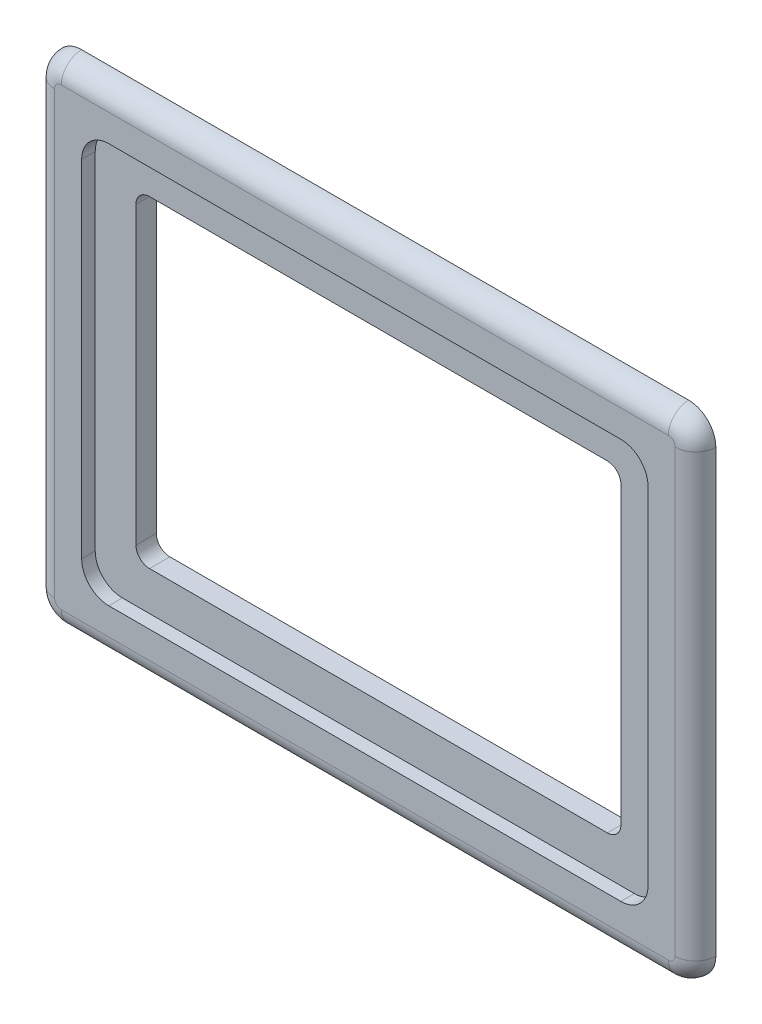
ISO-10303-21;
HEADER;
FILE_DESCRIPTION(('STEP AP214'),'2;1');
FILE_NAME('part.step','',(''),(''),'','','');
FILE_SCHEMA(('AUTOMOTIVE_DESIGN { 1 0 10303 214 1 1 1 1 }'));
ENDSEC;
DATA;
#1=APPLICATION_CONTEXT('core data for automotive mechanical design processes');
#2=APPLICATION_PROTOCOL_DEFINITION('international standard','automotive_design',2000,#1);
#3=PRODUCT_CONTEXT('',#1,'mechanical');
#4=PRODUCT('Part','Part','',(#3));
#5=PRODUCT_RELATED_PRODUCT_CATEGORY('part','',(#4));
#6=PRODUCT_DEFINITION_FORMATION('','',#4);
#7=PRODUCT_DEFINITION_CONTEXT('part definition',#1,'design');
#8=PRODUCT_DEFINITION('design','',#6,#7);
#9=PRODUCT_DEFINITION_SHAPE('','',#8);
#10=(LENGTH_UNIT() NAMED_UNIT(*) SI_UNIT(.MILLI.,.METRE.));
#11=(NAMED_UNIT(*) PLANE_ANGLE_UNIT() SI_UNIT($,.RADIAN.));
#12=(NAMED_UNIT(*) SI_UNIT($,.STERADIAN.) SOLID_ANGLE_UNIT());
#13=UNCERTAINTY_MEASURE_WITH_UNIT(LENGTH_MEASURE(1.E-05),#10,'distance_accuracy_value','');
#14=(GEOMETRIC_REPRESENTATION_CONTEXT(3) GLOBAL_UNCERTAINTY_ASSIGNED_CONTEXT((#13)) GLOBAL_UNIT_ASSIGNED_CONTEXT((#10,
#11,#12)) REPRESENTATION_CONTEXT('',''));
#15=CARTESIAN_POINT('',(0.,0.,0.));
#16=DIRECTION('',(0.,0.,1.));
#17=DIRECTION('',(1.,0.,0.));
#18=AXIS2_PLACEMENT_3D('',#15,#16,#17);
#19=CARTESIAN_POINT('',(113.50625,0.,9.525));
#20=DIRECTION('',(-1.,0.,0.));
#21=DIRECTION('',(0.,0.,1.));
#22=AXIS2_PLACEMENT_3D('',#19,#20,#21);
#23=PLANE('',#22);
#24=DIRECTION('',(0.,1.,0.));
#25=VECTOR('',#24,1.);
#26=CARTESIAN_POINT('',(113.50625,0.,-6.35));
#27=LINE('',#26,#25);
#28=CARTESIAN_POINT('',(113.50625,-69.05625,-6.35));
#29=VERTEX_POINT('',#28);
#30=CARTESIAN_POINT('',(113.50625,69.05625,-6.35));
#31=VERTEX_POINT('',#30);
#32=EDGE_CURVE('E447',#29,#31,#27,.T.);
#33=ORIENTED_EDGE('',*,*,#32,.F.);
#34=DIRECTION('',(0.,0.,-1.));
#35=VECTOR('',#34,1.);
#36=CARTESIAN_POINT('',(113.50625,-69.05625,3.175));
#37=LINE('',#36,#35);
#38=CARTESIAN_POINT('',(113.50625,-69.05625,3.175));
#39=VERTEX_POINT('',#38);
#40=EDGE_CURVE('E387',#29,#39,#37,.F.);
#41=ORIENTED_EDGE('',*,*,#40,.T.);
#42=DIRECTION('',(0.,-1.,0.));
#43=VECTOR('',#42,1.);
#44=CARTESIAN_POINT('',(113.50625,0.,3.175));
#45=LINE('',#44,#43);
#46=CARTESIAN_POINT('',(113.50625,69.05625,3.175));
#47=VERTEX_POINT('',#46);
#48=EDGE_CURVE('E506',#47,#39,#45,.T.);
#49=ORIENTED_EDGE('',*,*,#48,.F.);
#50=DIRECTION('',(0.,0.,-1.));
#51=VECTOR('',#50,1.);
#52=CARTESIAN_POINT('',(113.50625,69.05625,9.525));
#53=LINE('',#52,#51);
#54=EDGE_CURVE('E389',#47,#31,#53,.T.);
#55=ORIENTED_EDGE('',*,*,#54,.T.);
#56=EDGE_LOOP('',(#33,#41,#49,#55));
#57=FACE_BOUND('',#56,.T.);
#58=ADVANCED_FACE('F61',(#57),#23,.T.);
#59=CARTESIAN_POINT('',(0.,-75.40625,9.525));
#60=DIRECTION('',(0.,1.,0.));
#61=DIRECTION('',(0.,0.,1.));
#62=AXIS2_PLACEMENT_3D('',#59,#60,#61);
#63=PLANE('',#62);
#64=DIRECTION('',(-1.,0.,0.));
#65=VECTOR('',#64,1.);
#66=CARTESIAN_POINT('',(0.,-75.40625,3.175));
#67=LINE('',#66,#65);
#68=CARTESIAN_POINT('',(107.15625,-75.40625,3.175));
#69=VERTEX_POINT('',#68);
#70=CARTESIAN_POINT('',(-107.15625,-75.40625,3.175));
#71=VERTEX_POINT('',#70);
#72=EDGE_CURVE('E509',#69,#71,#67,.T.);
#73=ORIENTED_EDGE('',*,*,#72,.F.);
#74=DIRECTION('',(0.,0.,-1.));
#75=VECTOR('',#74,1.);
#76=CARTESIAN_POINT('',(107.15625,-75.40625,-6.35));
#77=LINE('',#76,#75);
#78=CARTESIAN_POINT('',(107.15625,-75.40625,-6.35));
#79=VERTEX_POINT('',#78);
#80=EDGE_CURVE('E392',#69,#79,#77,.T.);
#81=ORIENTED_EDGE('',*,*,#80,.T.);
#82=DIRECTION('',(1.,0.,0.));
#83=VECTOR('',#82,1.);
#84=CARTESIAN_POINT('',(0.,-75.40625,-6.35));
#85=LINE('',#84,#83);
#86=CARTESIAN_POINT('',(-107.15625,-75.40625,-6.35));
#87=VERTEX_POINT('',#86);
#88=EDGE_CURVE('E475',#87,#79,#85,.T.);
#89=ORIENTED_EDGE('',*,*,#88,.F.);
#90=DIRECTION('',(0.,0.,-1.));
#91=VECTOR('',#90,1.);
#92=CARTESIAN_POINT('',(-107.15625,-75.40625,9.525));
#93=LINE('',#92,#91);
#94=EDGE_CURVE('E395',#87,#71,#93,.F.);
#95=ORIENTED_EDGE('',*,*,#94,.T.);
#96=EDGE_LOOP('',(#73,#81,#89,#95));
#97=FACE_BOUND('',#96,.T.);
#98=ADVANCED_FACE('F532',(#97),#63,.T.);
#99=CARTESIAN_POINT('',(-113.50625,0.,9.525));
#100=DIRECTION('',(-1.,0.,0.));
#101=DIRECTION('',(0.,0.,1.));
#102=AXIS2_PLACEMENT_3D('',#99,#100,#101);
#103=PLANE('',#102);
#104=DIRECTION('',(0.,-1.,0.));
#105=VECTOR('',#104,1.);
#106=CARTESIAN_POINT('',(-113.50625,0.,3.175));
#107=LINE('',#106,#105);
#108=CARTESIAN_POINT('',(-113.50625,69.05625,3.175));
#109=VERTEX_POINT('',#108);
#110=CARTESIAN_POINT('',(-113.50625,-69.05625,3.175));
#111=VERTEX_POINT('',#110);
#112=EDGE_CURVE('E512',#109,#111,#107,.T.);
#113=ORIENTED_EDGE('',*,*,#112,.T.);
#114=DIRECTION('',(0.,0.,-1.));
#115=VECTOR('',#114,1.);
#116=CARTESIAN_POINT('',(-113.50625,-69.05625,9.525));
#117=LINE('',#116,#115);
#118=CARTESIAN_POINT('',(-113.50625,-69.05625,-6.35));
#119=VERTEX_POINT('',#118);
#120=EDGE_CURVE('E382',#111,#119,#117,.T.);
#121=ORIENTED_EDGE('',*,*,#120,.T.);
#122=DIRECTION('',(0.,1.,0.));
#123=VECTOR('',#122,1.);
#124=CARTESIAN_POINT('',(-113.50625,0.,-6.35));
#125=LINE('',#124,#123);
#126=CARTESIAN_POINT('',(-113.50625,69.05625,-6.35));
#127=VERTEX_POINT('',#126);
#128=EDGE_CURVE('E472',#119,#127,#125,.T.);
#129=ORIENTED_EDGE('',*,*,#128,.T.);
#130=DIRECTION('',(0.,0.,-1.));
#131=VECTOR('',#130,1.);
#132=CARTESIAN_POINT('',(-113.50625,69.05625,3.175));
#133=LINE('',#132,#131);
#134=EDGE_CURVE('E385',#127,#109,#133,.F.);
#135=ORIENTED_EDGE('',*,*,#134,.T.);
#136=EDGE_LOOP('',(#113,#121,#129,#135));
#137=FACE_BOUND('',#136,.T.);
#138=ADVANCED_FACE('F517',(#137),#103,.F.);
#139=CARTESIAN_POINT('',(0.,75.40625,9.525));
#140=DIRECTION('',(0.,1.,0.));
#141=DIRECTION('',(0.,0.,1.));
#142=AXIS2_PLACEMENT_3D('',#139,#140,#141);
#143=PLANE('',#142);
#144=DIRECTION('',(1.,0.,0.));
#145=VECTOR('',#144,1.);
#146=CARTESIAN_POINT('',(0.,75.40625,-6.35));
#147=LINE('',#146,#145);
#148=CARTESIAN_POINT('',(-107.15625,75.40625,-6.35));
#149=VERTEX_POINT('',#148);
#150=CARTESIAN_POINT('',(107.15625,75.40625,-6.35));
#151=VERTEX_POINT('',#150);
#152=EDGE_CURVE('E469',#149,#151,#147,.T.);
#153=ORIENTED_EDGE('',*,*,#152,.T.);
#154=DIRECTION('',(0.,0.,-1.));
#155=VECTOR('',#154,1.);
#156=CARTESIAN_POINT('',(107.15625,75.40625,9.525));
#157=LINE('',#156,#155);
#158=CARTESIAN_POINT('',(107.15625,75.40625,3.175));
#159=VERTEX_POINT('',#158);
#160=EDGE_CURVE('E377',#151,#159,#157,.F.);
#161=ORIENTED_EDGE('',*,*,#160,.T.);
#162=DIRECTION('',(-1.,0.,0.));
#163=VECTOR('',#162,1.);
#164=CARTESIAN_POINT('',(0.,75.40625,3.175));
#165=LINE('',#164,#163);
#166=CARTESIAN_POINT('',(-107.15625,75.40625,3.175));
#167=VERTEX_POINT('',#166);
#168=EDGE_CURVE('E493',#159,#167,#165,.T.);
#169=ORIENTED_EDGE('',*,*,#168,.T.);
#170=DIRECTION('',(0.,0.,-1.));
#171=VECTOR('',#170,1.);
#172=CARTESIAN_POINT('',(-107.15625,75.40625,-6.35));
#173=LINE('',#172,#171);
#174=EDGE_CURVE('E379',#167,#149,#173,.T.);
#175=ORIENTED_EDGE('',*,*,#174,.T.);
#176=EDGE_LOOP('',(#153,#161,#169,#175));
#177=FACE_BOUND('',#176,.T.);
#178=ADVANCED_FACE('F548',(#177),#143,.F.);
#179=CARTESIAN_POINT('',(0.,0.,9.525));
#180=DIRECTION('',(0.,0.,1.));
#181=DIRECTION('',(1.,0.,0.));
#182=AXIS2_PLACEMENT_3D('',#179,#180,#181);
#183=PLANE('',#182);
#184=DIRECTION('',(0.,1.,0.));
#185=VECTOR('',#184,1.);
#186=CARTESIAN_POINT('',(-145.25625,0.,9.525));
#187=LINE('',#186,#185);
#188=CARTESIAN_POINT('',(-145.25625,103.1875,9.525));
#189=VERTEX_POINT('',#188);
#190=CARTESIAN_POINT('',(-145.25625,-103.1875,9.525));
#191=VERTEX_POINT('',#190);
#192=EDGE_CURVE('E323',#189,#191,#187,.F.);
#193=ORIENTED_EDGE('',*,*,#192,.T.);
#194=CARTESIAN_POINT('',(-142.08125,-103.1875,9.525));
#195=DIRECTION('',(0.,0.,1.));
#196=DIRECTION('',(1.,0.,0.));
#197=AXIS2_PLACEMENT_3D('',#194,#195,#196);
#198=CIRCLE('',#197,3.175);
#199=CARTESIAN_POINT('',(-142.08125,-106.3625,9.525));
#200=VERTEX_POINT('',#199);
#201=EDGE_CURVE('E12',#191,#200,#198,.T.);
#202=ORIENTED_EDGE('',*,*,#201,.T.);
#203=DIRECTION('',(1.,0.,0.));
#204=VECTOR('',#203,1.);
#205=CARTESIAN_POINT('',(142.08125,-106.3625,9.525));
#206=LINE('',#205,#204);
#207=CARTESIAN_POINT('',(142.08125,-106.3625,9.525));
#208=VERTEX_POINT('',#207);
#209=EDGE_CURVE('E70',#200,#208,#206,.T.);
#210=ORIENTED_EDGE('',*,*,#209,.T.);
#211=CARTESIAN_POINT('',(142.08125,-103.1875,9.525));
#212=DIRECTION('',(0.,0.,1.));
#213=DIRECTION('',(1.,0.,0.));
#214=AXIS2_PLACEMENT_3D('',#211,#212,#213);
#215=CIRCLE('',#214,3.175);
#216=CARTESIAN_POINT('',(145.25625,-103.1875,9.525));
#217=VERTEX_POINT('',#216);
#218=EDGE_CURVE('E314',#208,#217,#215,.T.);
#219=ORIENTED_EDGE('',*,*,#218,.T.);
#220=DIRECTION('',(0.,1.,0.));
#221=VECTOR('',#220,1.);
#222=CARTESIAN_POINT('',(145.25625,103.1875,9.525));
#223=LINE('',#222,#221);
#224=CARTESIAN_POINT('',(145.25625,103.1875,9.525));
#225=VERTEX_POINT('',#224);
#226=EDGE_CURVE('E316',#217,#225,#223,.T.);
#227=ORIENTED_EDGE('',*,*,#226,.T.);
#228=CARTESIAN_POINT('',(142.08125,103.1875,9.525));
#229=DIRECTION('',(0.,0.,1.));
#230=DIRECTION('',(1.,0.,0.));
#231=AXIS2_PLACEMENT_3D('',#228,#229,#230);
#232=CIRCLE('',#231,3.175);
#233=CARTESIAN_POINT('',(142.08125,106.3625,9.525));
#234=VERTEX_POINT('',#233);
#235=EDGE_CURVE('E318',#225,#234,#232,.T.);
#236=ORIENTED_EDGE('',*,*,#235,.T.);
#237=DIRECTION('',(1.,0.,0.));
#238=VECTOR('',#237,1.);
#239=CARTESIAN_POINT('',(0.,106.3625,9.525));
#240=LINE('',#239,#238);
#241=CARTESIAN_POINT('',(-142.08125,106.3625,9.525));
#242=VERTEX_POINT('',#241);
#243=EDGE_CURVE('E320',#234,#242,#240,.F.);
#244=ORIENTED_EDGE('',*,*,#243,.T.);
#245=CARTESIAN_POINT('',(-142.08125,103.1875,9.525));
#246=DIRECTION('',(0.,0.,1.));
#247=DIRECTION('',(1.,0.,0.));
#248=AXIS2_PLACEMENT_3D('',#245,#246,#247);
#249=CIRCLE('',#248,3.175);
#250=EDGE_CURVE('E297',#242,#189,#249,.T.);
#251=ORIENTED_EDGE('',*,*,#250,.T.);
#252=EDGE_LOOP('',(#193,#202,#210,#219,#227,#236,#244,#251));
#253=FACE_BOUND('',#252,.T.);
#254=DIRECTION('',(0.,-1.,0.));
#255=VECTOR('',#254,1.);
#256=CARTESIAN_POINT('',(-132.55625,0.,9.525));
#257=LINE('',#256,#255);
#258=CARTESIAN_POINT('',(-132.55625,80.9625,9.525));
#259=VERTEX_POINT('',#258);
#260=CARTESIAN_POINT('',(-132.55625,-80.9625,9.525));
#261=VERTEX_POINT('',#260);
#262=EDGE_CURVE('E490',#259,#261,#257,.T.);
#263=ORIENTED_EDGE('',*,*,#262,.F.);
#264=CARTESIAN_POINT('',(-119.85625,80.9625,9.525));
#265=DIRECTION('',(0.,0.,1.));
#266=DIRECTION('',(1.,0.,0.));
#267=AXIS2_PLACEMENT_3D('',#264,#265,#266);
#268=CIRCLE('',#267,12.7);
#269=CARTESIAN_POINT('',(-119.85625,93.6625,9.525));
#270=VERTEX_POINT('',#269);
#271=EDGE_CURVE('E325',#259,#270,#268,.F.);
#272=ORIENTED_EDGE('',*,*,#271,.T.);
#273=DIRECTION('',(-1.,0.,0.));
#274=VECTOR('',#273,1.);
#275=CARTESIAN_POINT('',(0.,93.6625,9.525));
#276=LINE('',#275,#274);
#277=CARTESIAN_POINT('',(119.85625,93.6625,9.525));
#278=VERTEX_POINT('',#277);
#279=EDGE_CURVE('E480',#278,#270,#276,.T.);
#280=ORIENTED_EDGE('',*,*,#279,.F.);
#281=CARTESIAN_POINT('',(119.85625,80.9625,9.525));
#282=DIRECTION('',(0.,0.,1.));
#283=DIRECTION('',(1.,0.,0.));
#284=AXIS2_PLACEMENT_3D('',#281,#282,#283);
#285=CIRCLE('',#284,12.7);
#286=CARTESIAN_POINT('',(132.55625,80.9625,9.525));
#287=VERTEX_POINT('',#286);
#288=EDGE_CURVE('E331',#278,#287,#285,.F.);
#289=ORIENTED_EDGE('',*,*,#288,.T.);
#290=DIRECTION('',(0.,-1.,0.));
#291=VECTOR('',#290,1.);
#292=CARTESIAN_POINT('',(132.55625,0.,9.525));
#293=LINE('',#292,#291);
#294=CARTESIAN_POINT('',(132.55625,-80.9625,9.525));
#295=VERTEX_POINT('',#294);
#296=EDGE_CURVE('E484',#287,#295,#293,.T.);
#297=ORIENTED_EDGE('',*,*,#296,.T.);
#298=CARTESIAN_POINT('',(119.85625,-80.9625,9.525));
#299=DIRECTION('',(0.,0.,1.));
#300=DIRECTION('',(1.,0.,0.));
#301=AXIS2_PLACEMENT_3D('',#298,#299,#300);
#302=CIRCLE('',#301,12.7);
#303=CARTESIAN_POINT('',(119.85625,-93.6625,9.525));
#304=VERTEX_POINT('',#303);
#305=EDGE_CURVE('E329',#295,#304,#302,.F.);
#306=ORIENTED_EDGE('',*,*,#305,.T.);
#307=DIRECTION('',(-1.,0.,0.));
#308=VECTOR('',#307,1.);
#309=CARTESIAN_POINT('',(0.,-93.6625,9.525));
#310=LINE('',#309,#308);
#311=CARTESIAN_POINT('',(-119.85625,-93.6625,9.525));
#312=VERTEX_POINT('',#311);
#313=EDGE_CURVE('E487',#304,#312,#310,.T.);
#314=ORIENTED_EDGE('',*,*,#313,.T.);
#315=CARTESIAN_POINT('',(-119.85625,-80.9625,9.525));
#316=DIRECTION('',(0.,0.,1.));
#317=DIRECTION('',(1.,0.,0.));
#318=AXIS2_PLACEMENT_3D('',#315,#316,#317);
#319=CIRCLE('',#318,12.7);
#320=EDGE_CURVE('E327',#312,#261,#319,.F.);
#321=ORIENTED_EDGE('',*,*,#320,.T.);
#322=EDGE_LOOP('',(#263,#272,#280,#289,#297,#306,#314,#321));
#323=FACE_BOUND('',#322,.T.);
#324=ADVANCED_FACE('F575',(#253,#323),#183,.T.);
#325=CARTESIAN_POINT('',(0.,0.,0.));
#326=DIRECTION('',(0.,0.,1.));
#327=DIRECTION('',(1.,0.,0.));
#328=AXIS2_PLACEMENT_3D('',#325,#326,#327);
#329=PLANE('',#328);
#330=DIRECTION('',(0.,1.,0.));
#331=VECTOR('',#330,1.);
#332=CARTESIAN_POINT('',(-132.55625,0.,0.));
#333=LINE('',#332,#331);
#334=CARTESIAN_POINT('',(-132.55625,-80.9625,0.));
#335=VERTEX_POINT('',#334);
#336=CARTESIAN_POINT('',(-132.55625,80.9625,0.));
#337=VERTEX_POINT('',#336);
#338=EDGE_CURVE('E444',#335,#337,#333,.T.);
#339=ORIENTED_EDGE('',*,*,#338,.F.);
#340=CARTESIAN_POINT('',(-119.85625,-80.9625,0.));
#341=DIRECTION('',(0.,0.,1.));
#342=DIRECTION('',(1.,0.,0.));
#343=AXIS2_PLACEMENT_3D('',#340,#341,#342);
#344=CIRCLE('',#343,12.7);
#345=CARTESIAN_POINT('',(-119.85625,-93.6625,0.));
#346=VERTEX_POINT('',#345);
#347=EDGE_CURVE('E397',#335,#346,#344,.T.);
#348=ORIENTED_EDGE('',*,*,#347,.T.);
#349=DIRECTION('',(1.,0.,0.));
#350=VECTOR('',#349,1.);
#351=CARTESIAN_POINT('',(0.,-93.6625,0.));
#352=LINE('',#351,#350);
#353=CARTESIAN_POINT('',(119.85625,-93.6625,0.));
#354=VERTEX_POINT('',#353);
#355=EDGE_CURVE('E454',#346,#354,#352,.T.);
#356=ORIENTED_EDGE('',*,*,#355,.T.);
#357=CARTESIAN_POINT('',(119.85625,-80.9625,0.));
#358=DIRECTION('',(0.,0.,1.));
#359=DIRECTION('',(1.,0.,0.));
#360=AXIS2_PLACEMENT_3D('',#357,#358,#359);
#361=CIRCLE('',#360,12.7);
#362=CARTESIAN_POINT('',(132.55625,-80.9625,0.));
#363=VERTEX_POINT('',#362);
#364=EDGE_CURVE('E403',#354,#363,#361,.T.);
#365=ORIENTED_EDGE('',*,*,#364,.T.);
#366=DIRECTION('',(0.,1.,0.));
#367=VECTOR('',#366,1.);
#368=CARTESIAN_POINT('',(132.55625,0.,0.));
#369=LINE('',#368,#367);
#370=CARTESIAN_POINT('',(132.55625,80.9625,0.));
#371=VERTEX_POINT('',#370);
#372=EDGE_CURVE('E451',#363,#371,#369,.T.);
#373=ORIENTED_EDGE('',*,*,#372,.T.);
#374=CARTESIAN_POINT('',(119.85625,80.9625,0.));
#375=DIRECTION('',(0.,0.,1.));
#376=DIRECTION('',(1.,0.,0.));
#377=AXIS2_PLACEMENT_3D('',#374,#375,#376);
#378=CIRCLE('',#377,12.7);
#379=CARTESIAN_POINT('',(119.85625,93.6625,0.));
#380=VERTEX_POINT('',#379);
#381=EDGE_CURVE('E401',#371,#380,#378,.T.);
#382=ORIENTED_EDGE('',*,*,#381,.T.);
#383=DIRECTION('',(1.,0.,0.));
#384=VECTOR('',#383,1.);
#385=CARTESIAN_POINT('',(0.,93.6625,0.));
#386=LINE('',#385,#384);
#387=CARTESIAN_POINT('',(-119.85625,93.6625,0.));
#388=VERTEX_POINT('',#387);
#389=EDGE_CURVE('E448',#388,#380,#386,.T.);
#390=ORIENTED_EDGE('',*,*,#389,.F.);
#391=CARTESIAN_POINT('',(-119.85625,80.9625,0.));
#392=DIRECTION('',(0.,0.,1.));
#393=DIRECTION('',(1.,0.,0.));
#394=AXIS2_PLACEMENT_3D('',#391,#392,#393);
#395=CIRCLE('',#394,12.7);
#396=EDGE_CURVE('E399',#388,#337,#395,.T.);
#397=ORIENTED_EDGE('',*,*,#396,.T.);
#398=EDGE_LOOP('',(#339,#348,#356,#365,#373,#382,#390,#397));
#399=FACE_BOUND('',#398,.T.);
#400=DIRECTION('',(1.,0.,0.));
#401=VECTOR('',#400,1.);
#402=CARTESIAN_POINT('',(0.,115.8875,0.));
#403=LINE('',#402,#401);
#404=CARTESIAN_POINT('',(-142.08125,115.8875,0.));
#405=VERTEX_POINT('',#404);
#406=CARTESIAN_POINT('',(142.08125,115.8875,0.));
#407=VERTEX_POINT('',#406);
#408=EDGE_CURVE('E274',#405,#407,#403,.T.);
#409=ORIENTED_EDGE('',*,*,#408,.T.);
#410=CARTESIAN_POINT('',(142.08125,103.1875,0.));
#411=DIRECTION('',(0.,0.,1.));
#412=DIRECTION('',(1.,0.,0.));
#413=AXIS2_PLACEMENT_3D('',#410,#411,#412);
#414=CIRCLE('',#413,12.7);
#415=CARTESIAN_POINT('',(154.78125,103.1875,0.));
#416=VERTEX_POINT('',#415);
#417=EDGE_CURVE('E433',#407,#416,#414,.F.);
#418=ORIENTED_EDGE('',*,*,#417,.T.);
#419=DIRECTION('',(0.,1.,0.));
#420=VECTOR('',#419,1.);
#421=CARTESIAN_POINT('',(154.78125,0.,0.));
#422=LINE('',#421,#420);
#423=CARTESIAN_POINT('',(154.78125,-103.1875,0.));
#424=VERTEX_POINT('',#423);
#425=EDGE_CURVE('E294',#424,#416,#422,.T.);
#426=ORIENTED_EDGE('',*,*,#425,.F.);
#427=CARTESIAN_POINT('',(142.08125,-103.1875,0.));
#428=DIRECTION('',(0.,0.,1.));
#429=DIRECTION('',(1.,0.,0.));
#430=AXIS2_PLACEMENT_3D('',#427,#428,#429);
#431=CIRCLE('',#430,12.7);
#432=CARTESIAN_POINT('',(142.08125,-115.8875,0.));
#433=VERTEX_POINT('',#432);
#434=EDGE_CURVE('E283',#424,#433,#431,.F.);
#435=ORIENTED_EDGE('',*,*,#434,.T.);
#436=DIRECTION('',(1.,0.,0.));
#437=VECTOR('',#436,1.);
#438=CARTESIAN_POINT('',(0.,-115.8875,0.));
#439=LINE('',#438,#437);
#440=CARTESIAN_POINT('',(-142.08125,-115.8875,0.));
#441=VERTEX_POINT('',#440);
#442=EDGE_CURVE('E440',#441,#433,#439,.T.);
#443=ORIENTED_EDGE('',*,*,#442,.F.);
#444=CARTESIAN_POINT('',(-142.08125,-103.1875,0.));
#445=DIRECTION('',(0.,0.,1.));
#446=DIRECTION('',(1.,0.,0.));
#447=AXIS2_PLACEMENT_3D('',#444,#445,#446);
#448=CIRCLE('',#447,12.7);
#449=CARTESIAN_POINT('',(-154.78125,-103.1875,0.));
#450=VERTEX_POINT('',#449);
#451=EDGE_CURVE('E284',#441,#450,#448,.F.);
#452=ORIENTED_EDGE('',*,*,#451,.T.);
#453=DIRECTION('',(0.,1.,0.));
#454=VECTOR('',#453,1.);
#455=CARTESIAN_POINT('',(-154.78125,0.,0.));
#456=LINE('',#455,#454);
#457=CARTESIAN_POINT('',(-154.78125,103.1875,0.));
#458=VERTEX_POINT('',#457);
#459=EDGE_CURVE('E278',#450,#458,#456,.T.);
#460=ORIENTED_EDGE('',*,*,#459,.T.);
#461=CARTESIAN_POINT('',(-142.08125,103.1875,0.));
#462=DIRECTION('',(0.,0.,1.));
#463=DIRECTION('',(1.,0.,0.));
#464=AXIS2_PLACEMENT_3D('',#461,#462,#463);
#465=CIRCLE('',#464,12.7);
#466=EDGE_CURVE('E271',#458,#405,#465,.F.);
#467=ORIENTED_EDGE('',*,*,#466,.T.);
#468=EDGE_LOOP('',(#409,#418,#426,#435,#443,#452,#460,#467));
#469=FACE_BOUND('',#468,.T.);
#470=ADVANCED_FACE('F273',(#399,#469),#329,.F.);
#471=CARTESIAN_POINT('',(0.,-93.6625,-6.35));
#472=DIRECTION('',(0.,-1.,0.));
#473=DIRECTION('',(0.,0.,-1.));
#474=AXIS2_PLACEMENT_3D('',#471,#472,#473);
#475=PLANE('',#474);
#476=DIRECTION('',(1.,0.,0.));
#477=VECTOR('',#476,1.);
#478=CARTESIAN_POINT('',(0.,-93.6625,-6.35));
#479=LINE('',#478,#477);
#480=CARTESIAN_POINT('',(-119.85625,-93.6625,-6.35));
#481=VERTEX_POINT('',#480);
#482=CARTESIAN_POINT('',(119.85625,-93.6625,-6.35));
#483=VERTEX_POINT('',#482);
#484=EDGE_CURVE('E466',#481,#483,#479,.T.);
#485=ORIENTED_EDGE('',*,*,#484,.T.);
#486=DIRECTION('',(0.,0.,1.));
#487=VECTOR('',#486,1.);
#488=CARTESIAN_POINT('',(119.85625,-93.6625,-6.35));
#489=LINE('',#488,#487);
#490=EDGE_CURVE('E428',#483,#354,#489,.T.);
#491=ORIENTED_EDGE('',*,*,#490,.T.);
#492=ORIENTED_EDGE('',*,*,#355,.F.);
#493=DIRECTION('',(0.,0.,1.));
#494=VECTOR('',#493,1.);
#495=CARTESIAN_POINT('',(-119.85625,-93.6625,-6.35));
#496=LINE('',#495,#494);
#497=EDGE_CURVE('E431',#346,#481,#496,.F.);
#498=ORIENTED_EDGE('',*,*,#497,.T.);
#499=EDGE_LOOP('',(#485,#491,#492,#498));
#500=FACE_BOUND('',#499,.T.);
#501=ADVANCED_FACE('F684',(#500),#475,.T.);
#502=CARTESIAN_POINT('',(-132.55625,0.,-6.35));
#503=DIRECTION('',(1.,0.,0.));
#504=DIRECTION('',(0.,0.,-1.));
#505=AXIS2_PLACEMENT_3D('',#502,#503,#504);
#506=PLANE('',#505);
#507=ORIENTED_EDGE('',*,*,#338,.T.);
#508=DIRECTION('',(0.,0.,1.));
#509=VECTOR('',#508,1.);
#510=CARTESIAN_POINT('',(-132.55625,80.9625,-6.35));
#511=LINE('',#510,#509);
#512=CARTESIAN_POINT('',(-132.55625,80.9625,-6.35));
#513=VERTEX_POINT('',#512);
#514=EDGE_CURVE('E405',#337,#513,#511,.F.);
#515=ORIENTED_EDGE('',*,*,#514,.T.);
#516=DIRECTION('',(0.,1.,0.));
#517=VECTOR('',#516,1.);
#518=CARTESIAN_POINT('',(-132.55625,0.,-6.35));
#519=LINE('',#518,#517);
#520=CARTESIAN_POINT('',(-132.55625,-80.9625,-6.35));
#521=VERTEX_POINT('',#520);
#522=EDGE_CURVE('E443',#521,#513,#519,.T.);
#523=ORIENTED_EDGE('',*,*,#522,.F.);
#524=DIRECTION('',(0.,0.,1.));
#525=VECTOR('',#524,1.);
#526=CARTESIAN_POINT('',(-132.55625,-80.9625,0.));
#527=LINE('',#526,#525);
#528=EDGE_CURVE('E407',#521,#335,#527,.T.);
#529=ORIENTED_EDGE('',*,*,#528,.T.);
#530=EDGE_LOOP('',(#507,#515,#523,#529));
#531=FACE_BOUND('',#530,.T.);
#532=ADVANCED_FACE('F865',(#531),#506,.F.);
#533=CARTESIAN_POINT('',(0.,93.6625,-6.35));
#534=DIRECTION('',(0.,-1.,0.));
#535=DIRECTION('',(0.,0.,-1.));
#536=AXIS2_PLACEMENT_3D('',#533,#534,#535);
#537=PLANE('',#536);
#538=ORIENTED_EDGE('',*,*,#389,.T.);
#539=DIRECTION('',(0.,0.,1.));
#540=VECTOR('',#539,1.);
#541=CARTESIAN_POINT('',(119.85625,93.6625,-6.35));
#542=LINE('',#541,#540);
#543=CARTESIAN_POINT('',(119.85625,93.6625,-6.35));
#544=VERTEX_POINT('',#543);
#545=EDGE_CURVE('E410',#380,#544,#542,.F.);
#546=ORIENTED_EDGE('',*,*,#545,.T.);
#547=DIRECTION('',(1.,0.,0.));
#548=VECTOR('',#547,1.);
#549=CARTESIAN_POINT('',(0.,93.6625,-6.35));
#550=LINE('',#549,#548);
#551=CARTESIAN_POINT('',(-119.85625,93.6625,-6.35));
#552=VERTEX_POINT('',#551);
#553=EDGE_CURVE('E460',#552,#544,#550,.T.);
#554=ORIENTED_EDGE('',*,*,#553,.F.);
#555=DIRECTION('',(0.,0.,1.));
#556=VECTOR('',#555,1.);
#557=CARTESIAN_POINT('',(-119.85625,93.6625,-6.35));
#558=LINE('',#557,#556);
#559=EDGE_CURVE('E412',#552,#388,#558,.T.);
#560=ORIENTED_EDGE('',*,*,#559,.T.);
#561=EDGE_LOOP('',(#538,#546,#554,#560));
#562=FACE_BOUND('',#561,.T.);
#563=ADVANCED_FACE('F871',(#562),#537,.F.);
#564=CARTESIAN_POINT('',(132.55625,0.,-6.35));
#565=DIRECTION('',(1.,0.,0.));
#566=DIRECTION('',(0.,0.,-1.));
#567=AXIS2_PLACEMENT_3D('',#564,#565,#566);
#568=PLANE('',#567);
#569=ORIENTED_EDGE('',*,*,#372,.F.);
#570=DIRECTION('',(0.,0.,1.));
#571=VECTOR('',#570,1.);
#572=CARTESIAN_POINT('',(132.55625,-80.9625,-6.35));
#573=LINE('',#572,#571);
#574=CARTESIAN_POINT('',(132.55625,-80.9625,-6.35));
#575=VERTEX_POINT('',#574);
#576=EDGE_CURVE('E423',#363,#575,#573,.F.);
#577=ORIENTED_EDGE('',*,*,#576,.T.);
#578=DIRECTION('',(0.,1.,0.));
#579=VECTOR('',#578,1.);
#580=CARTESIAN_POINT('',(132.55625,0.,-6.35));
#581=LINE('',#580,#579);
#582=CARTESIAN_POINT('',(132.55625,80.9625,-6.35));
#583=VERTEX_POINT('',#582);
#584=EDGE_CURVE('E463',#575,#583,#581,.T.);
#585=ORIENTED_EDGE('',*,*,#584,.T.);
#586=DIRECTION('',(0.,0.,1.));
#587=VECTOR('',#586,1.);
#588=CARTESIAN_POINT('',(132.55625,80.9625,0.));
#589=LINE('',#588,#587);
#590=EDGE_CURVE('E425',#583,#371,#589,.T.);
#591=ORIENTED_EDGE('',*,*,#590,.T.);
#592=EDGE_LOOP('',(#569,#577,#585,#591));
#593=FACE_BOUND('',#592,.T.);
#594=ADVANCED_FACE('F710',(#593),#568,.T.);
#595=CARTESIAN_POINT('',(0.,0.,-6.35));
#596=DIRECTION('',(0.,0.,1.));
#597=DIRECTION('',(1.,0.,0.));
#598=AXIS2_PLACEMENT_3D('',#595,#596,#597);
#599=PLANE('',#598);
#600=ORIENTED_EDGE('',*,*,#88,.T.);
#601=CARTESIAN_POINT('',(107.15625,-69.05625,-6.35));
#602=DIRECTION('',(0.,0.,1.));
#603=DIRECTION('',(1.,0.,0.));
#604=AXIS2_PLACEMENT_3D('',#601,#602,#603);
#605=CIRCLE('',#604,6.35);
#606=EDGE_CURVE('E375',#79,#29,#605,.T.);
#607=ORIENTED_EDGE('',*,*,#606,.T.);
#608=ORIENTED_EDGE('',*,*,#32,.T.);
#609=CARTESIAN_POINT('',(107.15625,69.05625,-6.35));
#610=DIRECTION('',(0.,0.,1.));
#611=DIRECTION('',(1.,0.,0.));
#612=AXIS2_PLACEMENT_3D('',#609,#610,#611);
#613=CIRCLE('',#612,6.35);
#614=EDGE_CURVE('E367',#31,#151,#613,.T.);
#615=ORIENTED_EDGE('',*,*,#614,.T.);
#616=ORIENTED_EDGE('',*,*,#152,.F.);
#617=CARTESIAN_POINT('',(-107.15625,69.05625,-6.35));
#618=DIRECTION('',(0.,0.,1.));
#619=DIRECTION('',(1.,0.,0.));
#620=AXIS2_PLACEMENT_3D('',#617,#618,#619);
#621=CIRCLE('',#620,6.35);
#622=EDGE_CURVE('E363',#149,#127,#621,.T.);
#623=ORIENTED_EDGE('',*,*,#622,.T.);
#624=ORIENTED_EDGE('',*,*,#128,.F.);
#625=CARTESIAN_POINT('',(-107.15625,-69.05625,-6.35));
#626=DIRECTION('',(0.,0.,1.));
#627=DIRECTION('',(1.,0.,0.));
#628=AXIS2_PLACEMENT_3D('',#625,#626,#627);
#629=CIRCLE('',#628,6.35);
#630=EDGE_CURVE('E371',#119,#87,#629,.T.);
#631=ORIENTED_EDGE('',*,*,#630,.T.);
#632=EDGE_LOOP('',(#600,#607,#608,#615,#616,#623,#624,#631));
#633=FACE_BOUND('',#632,.T.);
#634=ORIENTED_EDGE('',*,*,#584,.F.);
#635=CARTESIAN_POINT('',(119.85625,-80.9625,-6.35));
#636=DIRECTION('',(0.,0.,1.));
#637=DIRECTION('',(1.,0.,0.));
#638=AXIS2_PLACEMENT_3D('',#635,#636,#637);
#639=CIRCLE('',#638,12.7);
#640=EDGE_CURVE('E415',#575,#483,#639,.F.);
#641=ORIENTED_EDGE('',*,*,#640,.T.);
#642=ORIENTED_EDGE('',*,*,#484,.F.);
#643=CARTESIAN_POINT('',(-119.85625,-80.9625,-6.35));
#644=DIRECTION('',(0.,0.,1.));
#645=DIRECTION('',(1.,0.,0.));
#646=AXIS2_PLACEMENT_3D('',#643,#644,#645);
#647=CIRCLE('',#646,12.7);
#648=EDGE_CURVE('E421',#481,#521,#647,.F.);
#649=ORIENTED_EDGE('',*,*,#648,.T.);
#650=ORIENTED_EDGE('',*,*,#522,.T.);
#651=CARTESIAN_POINT('',(-119.85625,80.9625,-6.35));
#652=DIRECTION('',(0.,0.,1.));
#653=DIRECTION('',(1.,0.,0.));
#654=AXIS2_PLACEMENT_3D('',#651,#652,#653);
#655=CIRCLE('',#654,12.7);
#656=EDGE_CURVE('E419',#513,#552,#655,.F.);
#657=ORIENTED_EDGE('',*,*,#656,.T.);
#658=ORIENTED_EDGE('',*,*,#553,.T.);
#659=CARTESIAN_POINT('',(119.85625,80.9625,-6.35));
#660=DIRECTION('',(0.,0.,1.));
#661=DIRECTION('',(1.,0.,0.));
#662=AXIS2_PLACEMENT_3D('',#659,#660,#661);
#663=CIRCLE('',#662,12.7);
#664=EDGE_CURVE('E417',#544,#583,#663,.F.);
#665=ORIENTED_EDGE('',*,*,#664,.T.);
#666=EDGE_LOOP('',(#634,#641,#642,#649,#650,#657,#658,#665));
#667=FACE_BOUND('',#666,.T.);
#668=ADVANCED_FACE('F528',(#633,#667),#599,.F.);
#669=CARTESIAN_POINT('',(119.85625,-80.9625,-6.35));
#670=DIRECTION('',(0.,0.,1.));
#671=DIRECTION('',(1.,0.,0.));
#672=AXIS2_PLACEMENT_3D('',#669,#670,#671);
#673=CYLINDRICAL_SURFACE('',#672,12.7);
#674=ORIENTED_EDGE('',*,*,#640,.F.);
#675=ORIENTED_EDGE('',*,*,#576,.F.);
#676=ORIENTED_EDGE('',*,*,#364,.F.);
#677=ORIENTED_EDGE('',*,*,#490,.F.);
#678=EDGE_LOOP('',(#674,#675,#676,#677));
#679=FACE_BOUND('',#678,.T.);
#680=ADVANCED_FACE('F611',(#679),#673,.T.);
#681=CARTESIAN_POINT('',(119.85625,80.9625,-6.35));
#682=DIRECTION('',(0.,0.,-1.));
#683=DIRECTION('',(-1.,0.,0.));
#684=AXIS2_PLACEMENT_3D('',#681,#682,#683);
#685=CYLINDRICAL_SURFACE('',#684,12.7);
#686=ORIENTED_EDGE('',*,*,#664,.F.);
#687=ORIENTED_EDGE('',*,*,#545,.F.);
#688=ORIENTED_EDGE('',*,*,#381,.F.);
#689=ORIENTED_EDGE('',*,*,#590,.F.);
#690=EDGE_LOOP('',(#686,#687,#688,#689));
#691=FACE_BOUND('',#690,.T.);
#692=ADVANCED_FACE('F614',(#691),#685,.T.);
#693=CARTESIAN_POINT('',(-119.85625,80.9625,-6.35));
#694=DIRECTION('',(0.,0.,1.));
#695=DIRECTION('',(1.,0.,0.));
#696=AXIS2_PLACEMENT_3D('',#693,#694,#695);
#697=CYLINDRICAL_SURFACE('',#696,12.7);
#698=ORIENTED_EDGE('',*,*,#656,.F.);
#699=ORIENTED_EDGE('',*,*,#514,.F.);
#700=ORIENTED_EDGE('',*,*,#396,.F.);
#701=ORIENTED_EDGE('',*,*,#559,.F.);
#702=EDGE_LOOP('',(#698,#699,#700,#701));
#703=FACE_BOUND('',#702,.T.);
#704=ADVANCED_FACE('F618',(#703),#697,.T.);
#705=CARTESIAN_POINT('',(-119.85625,-80.9625,-6.35));
#706=DIRECTION('',(0.,0.,-1.));
#707=DIRECTION('',(-1.,0.,0.));
#708=AXIS2_PLACEMENT_3D('',#705,#706,#707);
#709=CYLINDRICAL_SURFACE('',#708,12.7);
#710=ORIENTED_EDGE('',*,*,#648,.F.);
#711=ORIENTED_EDGE('',*,*,#497,.F.);
#712=ORIENTED_EDGE('',*,*,#347,.F.);
#713=ORIENTED_EDGE('',*,*,#528,.F.);
#714=EDGE_LOOP('',(#710,#711,#712,#713));
#715=FACE_BOUND('',#714,.T.);
#716=ADVANCED_FACE('F622',(#715),#709,.T.);
#717=CARTESIAN_POINT('',(-132.55625,0.,3.175));
#718=DIRECTION('',(-1.,0.,0.));
#719=DIRECTION('',(0.,0.,1.));
#720=AXIS2_PLACEMENT_3D('',#717,#718,#719);
#721=PLANE('',#720);
#722=ORIENTED_EDGE('',*,*,#262,.T.);
#723=DIRECTION('',(0.,0.,1.));
#724=VECTOR('',#723,1.);
#725=CARTESIAN_POINT('',(-132.55625,-80.9625,3.175));
#726=LINE('',#725,#724);
#727=CARTESIAN_POINT('',(-132.55625,-80.9625,3.175));
#728=VERTEX_POINT('',#727);
#729=EDGE_CURVE('E333',#261,#728,#726,.F.);
#730=ORIENTED_EDGE('',*,*,#729,.T.);
#731=DIRECTION('',(0.,-1.,0.));
#732=VECTOR('',#731,1.);
#733=CARTESIAN_POINT('',(-132.55625,0.,3.175));
#734=LINE('',#733,#732);
#735=CARTESIAN_POINT('',(-132.55625,80.9625,3.175));
#736=VERTEX_POINT('',#735);
#737=EDGE_CURVE('E483',#736,#728,#734,.T.);
#738=ORIENTED_EDGE('',*,*,#737,.F.);
#739=DIRECTION('',(0.,0.,1.));
#740=VECTOR('',#739,1.);
#741=CARTESIAN_POINT('',(-132.55625,80.9625,9.525));
#742=LINE('',#741,#740);
#743=EDGE_CURVE('E335',#736,#259,#742,.T.);
#744=ORIENTED_EDGE('',*,*,#743,.T.);
#745=EDGE_LOOP('',(#722,#730,#738,#744));
#746=FACE_BOUND('',#745,.T.);
#747=ADVANCED_FACE('F583',(#746),#721,.F.);
#748=CARTESIAN_POINT('',(0.,93.6625,3.175));
#749=DIRECTION('',(0.,1.,0.));
#750=DIRECTION('',(0.,0.,1.));
#751=AXIS2_PLACEMENT_3D('',#748,#749,#750);
#752=PLANE('',#751);
#753=DIRECTION('',(-1.,0.,0.));
#754=VECTOR('',#753,1.);
#755=CARTESIAN_POINT('',(0.,93.6625,3.175));
#756=LINE('',#755,#754);
#757=CARTESIAN_POINT('',(119.85625,93.6625,3.175));
#758=VERTEX_POINT('',#757);
#759=CARTESIAN_POINT('',(-119.85625,93.6625,3.175));
#760=VERTEX_POINT('',#759);
#761=EDGE_CURVE('E457',#758,#760,#756,.T.);
#762=ORIENTED_EDGE('',*,*,#761,.F.);
#763=DIRECTION('',(0.,0.,1.));
#764=VECTOR('',#763,1.);
#765=CARTESIAN_POINT('',(119.85625,93.6625,3.175));
#766=LINE('',#765,#764);
#767=EDGE_CURVE('E356',#758,#278,#766,.T.);
#768=ORIENTED_EDGE('',*,*,#767,.T.);
#769=ORIENTED_EDGE('',*,*,#279,.T.);
#770=DIRECTION('',(0.,0.,1.));
#771=VECTOR('',#770,1.);
#772=CARTESIAN_POINT('',(-119.85625,93.6625,3.175));
#773=LINE('',#772,#771);
#774=EDGE_CURVE('E359',#270,#760,#773,.F.);
#775=ORIENTED_EDGE('',*,*,#774,.T.);
#776=EDGE_LOOP('',(#762,#768,#769,#775));
#777=FACE_BOUND('',#776,.T.);
#778=ADVANCED_FACE('F571',(#777),#752,.F.);
#779=CARTESIAN_POINT('',(132.55625,0.,3.175));
#780=DIRECTION('',(-1.,0.,0.));
#781=DIRECTION('',(0.,0.,1.));
#782=AXIS2_PLACEMENT_3D('',#779,#780,#781);
#783=PLANE('',#782);
#784=ORIENTED_EDGE('',*,*,#296,.F.);
#785=DIRECTION('',(0.,0.,1.));
#786=VECTOR('',#785,1.);
#787=CARTESIAN_POINT('',(132.55625,80.9625,3.175));
#788=LINE('',#787,#786);
#789=CARTESIAN_POINT('',(132.55625,80.9625,3.175));
#790=VERTEX_POINT('',#789);
#791=EDGE_CURVE('E351',#287,#790,#788,.F.);
#792=ORIENTED_EDGE('',*,*,#791,.T.);
#793=DIRECTION('',(0.,-1.,0.));
#794=VECTOR('',#793,1.);
#795=CARTESIAN_POINT('',(132.55625,0.,3.175));
#796=LINE('',#795,#794);
#797=CARTESIAN_POINT('',(132.55625,-80.9625,3.175));
#798=VERTEX_POINT('',#797);
#799=EDGE_CURVE('E496',#790,#798,#796,.T.);
#800=ORIENTED_EDGE('',*,*,#799,.T.);
#801=DIRECTION('',(0.,0.,1.));
#802=VECTOR('',#801,1.);
#803=CARTESIAN_POINT('',(132.55625,-80.9625,9.525));
#804=LINE('',#803,#802);
#805=EDGE_CURVE('E353',#798,#295,#804,.T.);
#806=ORIENTED_EDGE('',*,*,#805,.T.);
#807=EDGE_LOOP('',(#784,#792,#800,#806));
#808=FACE_BOUND('',#807,.T.);
#809=ADVANCED_FACE('F594',(#808),#783,.T.);
#810=CARTESIAN_POINT('',(0.,-93.6625,3.175));
#811=DIRECTION('',(0.,1.,0.));
#812=DIRECTION('',(0.,0.,1.));
#813=AXIS2_PLACEMENT_3D('',#810,#811,#812);
#814=PLANE('',#813);
#815=ORIENTED_EDGE('',*,*,#313,.F.);
#816=DIRECTION('',(0.,0.,1.));
#817=VECTOR('',#816,1.);
#818=CARTESIAN_POINT('',(119.85625,-93.6625,3.175));
#819=LINE('',#818,#817);
#820=CARTESIAN_POINT('',(119.85625,-93.6625,3.175));
#821=VERTEX_POINT('',#820);
#822=EDGE_CURVE('E338',#304,#821,#819,.F.);
#823=ORIENTED_EDGE('',*,*,#822,.T.);
#824=DIRECTION('',(-1.,0.,0.));
#825=VECTOR('',#824,1.);
#826=CARTESIAN_POINT('',(0.,-93.6625,3.175));
#827=LINE('',#826,#825);
#828=CARTESIAN_POINT('',(-119.85625,-93.6625,3.175));
#829=VERTEX_POINT('',#828);
#830=EDGE_CURVE('E499',#821,#829,#827,.T.);
#831=ORIENTED_EDGE('',*,*,#830,.T.);
#832=DIRECTION('',(0.,0.,1.));
#833=VECTOR('',#832,1.);
#834=CARTESIAN_POINT('',(-119.85625,-93.6625,3.175));
#835=LINE('',#834,#833);
#836=EDGE_CURVE('E340',#829,#312,#835,.T.);
#837=ORIENTED_EDGE('',*,*,#836,.T.);
#838=EDGE_LOOP('',(#815,#823,#831,#837));
#839=FACE_BOUND('',#838,.T.);
#840=ADVANCED_FACE('F556',(#839),#814,.T.);
#841=CARTESIAN_POINT('',(0.,0.,3.175));
#842=DIRECTION('',(0.,0.,-1.));
#843=DIRECTION('',(-1.,0.,0.));
#844=AXIS2_PLACEMENT_3D('',#841,#842,#843);
#845=PLANE('',#844);
#846=ORIENTED_EDGE('',*,*,#112,.F.);
#847=CARTESIAN_POINT('',(-107.15625,69.05625,3.175));
#848=DIRECTION('',(0.,0.,-1.));
#849=DIRECTION('',(-1.,0.,0.));
#850=AXIS2_PLACEMENT_3D('',#847,#848,#849);
#851=CIRCLE('',#850,6.35);
#852=EDGE_CURVE('E361',#109,#167,#851,.T.);
#853=ORIENTED_EDGE('',*,*,#852,.T.);
#854=ORIENTED_EDGE('',*,*,#168,.F.);
#855=CARTESIAN_POINT('',(107.15625,69.05625,3.175));
#856=DIRECTION('',(0.,0.,-1.));
#857=DIRECTION('',(-1.,0.,0.));
#858=AXIS2_PLACEMENT_3D('',#855,#856,#857);
#859=CIRCLE('',#858,6.35);
#860=EDGE_CURVE('E365',#159,#47,#859,.T.);
#861=ORIENTED_EDGE('',*,*,#860,.T.);
#862=ORIENTED_EDGE('',*,*,#48,.T.);
#863=CARTESIAN_POINT('',(107.15625,-69.05625,3.175));
#864=DIRECTION('',(0.,0.,-1.));
#865=DIRECTION('',(-1.,0.,0.));
#866=AXIS2_PLACEMENT_3D('',#863,#864,#865);
#867=CIRCLE('',#866,6.35);
#868=EDGE_CURVE('E373',#39,#69,#867,.T.);
#869=ORIENTED_EDGE('',*,*,#868,.T.);
#870=ORIENTED_EDGE('',*,*,#72,.T.);
#871=CARTESIAN_POINT('',(-107.15625,-69.05625,3.175));
#872=DIRECTION('',(0.,0.,-1.));
#873=DIRECTION('',(-1.,0.,0.));
#874=AXIS2_PLACEMENT_3D('',#871,#872,#873);
#875=CIRCLE('',#874,6.35);
#876=EDGE_CURVE('E369',#71,#111,#875,.T.);
#877=ORIENTED_EDGE('',*,*,#876,.T.);
#878=EDGE_LOOP('',(#846,#853,#854,#861,#862,#869,#870,#877));
#879=FACE_BOUND('',#878,.T.);
#880=ORIENTED_EDGE('',*,*,#799,.F.);
#881=CARTESIAN_POINT('',(119.85625,80.9625,3.175));
#882=DIRECTION('',(0.,0.,-1.));
#883=DIRECTION('',(-1.,0.,0.));
#884=AXIS2_PLACEMENT_3D('',#881,#882,#883);
#885=CIRCLE('',#884,12.7);
#886=EDGE_CURVE('E343',#790,#758,#885,.F.);
#887=ORIENTED_EDGE('',*,*,#886,.T.);
#888=ORIENTED_EDGE('',*,*,#761,.T.);
#889=CARTESIAN_POINT('',(-119.85625,80.9625,3.175));
#890=DIRECTION('',(0.,0.,-1.));
#891=DIRECTION('',(-1.,0.,0.));
#892=AXIS2_PLACEMENT_3D('',#889,#890,#891);
#893=CIRCLE('',#892,12.7);
#894=EDGE_CURVE('E349',#760,#736,#893,.F.);
#895=ORIENTED_EDGE('',*,*,#894,.T.);
#896=ORIENTED_EDGE('',*,*,#737,.T.);
#897=CARTESIAN_POINT('',(-119.85625,-80.9625,3.175));
#898=DIRECTION('',(0.,0.,-1.));
#899=DIRECTION('',(-1.,0.,0.));
#900=AXIS2_PLACEMENT_3D('',#897,#898,#899);
#901=CIRCLE('',#900,12.7);
#902=EDGE_CURVE('E347',#728,#829,#901,.F.);
#903=ORIENTED_EDGE('',*,*,#902,.T.);
#904=ORIENTED_EDGE('',*,*,#830,.F.);
#905=CARTESIAN_POINT('',(119.85625,-80.9625,3.175));
#906=DIRECTION('',(0.,0.,-1.));
#907=DIRECTION('',(-1.,0.,0.));
#908=AXIS2_PLACEMENT_3D('',#905,#906,#907);
#909=CIRCLE('',#908,12.7);
#910=EDGE_CURVE('E345',#821,#798,#909,.F.);
#911=ORIENTED_EDGE('',*,*,#910,.T.);
#912=EDGE_LOOP('',(#880,#887,#888,#895,#896,#903,#904,#911));
#913=FACE_BOUND('',#912,.T.);
#914=ADVANCED_FACE('F553',(#879,#913),#845,.F.);
#915=CARTESIAN_POINT('',(107.15625,-69.05625,9.525));
#916=DIRECTION('',(0.,0.,1.));
#917=DIRECTION('',(1.,0.,0.));
#918=AXIS2_PLACEMENT_3D('',#915,#916,#917);
#919=CYLINDRICAL_SURFACE('',#918,6.35);
#920=ORIENTED_EDGE('',*,*,#868,.F.);
#921=ORIENTED_EDGE('',*,*,#40,.F.);
#922=ORIENTED_EDGE('',*,*,#606,.F.);
#923=ORIENTED_EDGE('',*,*,#80,.F.);
#924=EDGE_LOOP('',(#920,#921,#922,#923));
#925=FACE_BOUND('',#924,.T.);
#926=ADVANCED_FACE('F536',(#925),#919,.F.);
#927=CARTESIAN_POINT('',(-107.15625,-69.05625,9.525));
#928=DIRECTION('',(0.,0.,-1.));
#929=DIRECTION('',(-1.,0.,0.));
#930=AXIS2_PLACEMENT_3D('',#927,#928,#929);
#931=CYLINDRICAL_SURFACE('',#930,6.35);
#932=ORIENTED_EDGE('',*,*,#876,.F.);
#933=ORIENTED_EDGE('',*,*,#94,.F.);
#934=ORIENTED_EDGE('',*,*,#630,.F.);
#935=ORIENTED_EDGE('',*,*,#120,.F.);
#936=EDGE_LOOP('',(#932,#933,#934,#935));
#937=FACE_BOUND('',#936,.T.);
#938=ADVANCED_FACE('F524',(#937),#931,.F.);
#939=CARTESIAN_POINT('',(107.15625,69.05625,9.525));
#940=DIRECTION('',(0.,0.,-1.));
#941=DIRECTION('',(-1.,0.,0.));
#942=AXIS2_PLACEMENT_3D('',#939,#940,#941);
#943=CYLINDRICAL_SURFACE('',#942,6.35);
#944=ORIENTED_EDGE('',*,*,#860,.F.);
#945=ORIENTED_EDGE('',*,*,#160,.F.);
#946=ORIENTED_EDGE('',*,*,#614,.F.);
#947=ORIENTED_EDGE('',*,*,#54,.F.);
#948=EDGE_LOOP('',(#944,#945,#946,#947));
#949=FACE_BOUND('',#948,.T.);
#950=ADVANCED_FACE('F544',(#949),#943,.F.);
#951=CARTESIAN_POINT('',(-107.15625,69.05625,9.525));
#952=DIRECTION('',(0.,0.,1.));
#953=DIRECTION('',(1.,0.,0.));
#954=AXIS2_PLACEMENT_3D('',#951,#952,#953);
#955=CYLINDRICAL_SURFACE('',#954,6.35);
#956=ORIENTED_EDGE('',*,*,#852,.F.);
#957=ORIENTED_EDGE('',*,*,#134,.F.);
#958=ORIENTED_EDGE('',*,*,#622,.F.);
#959=ORIENTED_EDGE('',*,*,#174,.F.);
#960=EDGE_LOOP('',(#956,#957,#958,#959));
#961=FACE_BOUND('',#960,.T.);
#962=ADVANCED_FACE('F552',(#961),#955,.F.);
#963=CARTESIAN_POINT('',(119.85625,80.9625,3.175));
#964=DIRECTION('',(0.,0.,1.));
#965=DIRECTION('',(1.,0.,0.));
#966=AXIS2_PLACEMENT_3D('',#963,#964,#965);
#967=CYLINDRICAL_SURFACE('',#966,12.7);
#968=ORIENTED_EDGE('',*,*,#886,.F.);
#969=ORIENTED_EDGE('',*,*,#791,.F.);
#970=ORIENTED_EDGE('',*,*,#288,.F.);
#971=ORIENTED_EDGE('',*,*,#767,.F.);
#972=EDGE_LOOP('',(#968,#969,#970,#971));
#973=FACE_BOUND('',#972,.T.);
#974=ADVANCED_FACE('F568',(#973),#967,.F.);
#975=CARTESIAN_POINT('',(119.85625,-80.9625,3.175));
#976=DIRECTION('',(0.,0.,-1.));
#977=DIRECTION('',(-1.,0.,0.));
#978=AXIS2_PLACEMENT_3D('',#975,#976,#977);
#979=CYLINDRICAL_SURFACE('',#978,12.7);
#980=ORIENTED_EDGE('',*,*,#910,.F.);
#981=ORIENTED_EDGE('',*,*,#822,.F.);
#982=ORIENTED_EDGE('',*,*,#305,.F.);
#983=ORIENTED_EDGE('',*,*,#805,.F.);
#984=EDGE_LOOP('',(#980,#981,#982,#983));
#985=FACE_BOUND('',#984,.T.);
#986=ADVANCED_FACE('F593',(#985),#979,.F.);
#987=CARTESIAN_POINT('',(-119.85625,-80.9625,3.175));
#988=DIRECTION('',(0.,0.,1.));
#989=DIRECTION('',(1.,0.,0.));
#990=AXIS2_PLACEMENT_3D('',#987,#988,#989);
#991=CYLINDRICAL_SURFACE('',#990,12.7);
#992=ORIENTED_EDGE('',*,*,#902,.F.);
#993=ORIENTED_EDGE('',*,*,#729,.F.);
#994=ORIENTED_EDGE('',*,*,#320,.F.);
#995=ORIENTED_EDGE('',*,*,#836,.F.);
#996=EDGE_LOOP('',(#992,#993,#994,#995));
#997=FACE_BOUND('',#996,.T.);
#998=ADVANCED_FACE('F588',(#997),#991,.F.);
#999=CARTESIAN_POINT('',(-119.85625,80.9625,3.175));
#1000=DIRECTION('',(0.,0.,-1.));
#1001=DIRECTION('',(-1.,0.,0.));
#1002=AXIS2_PLACEMENT_3D('',#999,#1000,#1001);
#1003=CYLINDRICAL_SURFACE('',#1002,12.7);
#1004=ORIENTED_EDGE('',*,*,#894,.F.);
#1005=ORIENTED_EDGE('',*,*,#774,.F.);
#1006=ORIENTED_EDGE('',*,*,#271,.F.);
#1007=ORIENTED_EDGE('',*,*,#743,.F.);
#1008=EDGE_LOOP('',(#1004,#1005,#1006,#1007));
#1009=FACE_BOUND('',#1008,.T.);
#1010=ADVANCED_FACE('F580',(#1009),#1003,.F.);
#1011=CARTESIAN_POINT('',(142.08125,103.1875,0.));
#1012=DIRECTION('',(0.,0.,1.));
#1013=DIRECTION('',(1.,0.,0.));
#1014=AXIS2_PLACEMENT_3D('',#1011,#1012,#1013);
#1015=DEGENERATE_TOROIDAL_SURFACE('',#1014,3.175,9.525,.T.);
#1016=CARTESIAN_POINT('',(145.25625,103.1875,0.));
#1017=DIRECTION('',(0.,-1.,0.));
#1018=DIRECTION('',(0.,0.,-1.));
#1019=AXIS2_PLACEMENT_3D('',#1016,#1017,#1018);
#1020=CIRCLE('',#1019,9.525);
#1021=EDGE_CURVE('E298',#416,#225,#1020,.T.);
#1022=ORIENTED_EDGE('',*,*,#1021,.F.);
#1023=ORIENTED_EDGE('',*,*,#417,.F.);
#1024=CARTESIAN_POINT('',(142.08125,106.3625,0.));
#1025=DIRECTION('',(-1.,0.,0.));
#1026=DIRECTION('',(0.,0.,1.));
#1027=AXIS2_PLACEMENT_3D('',#1024,#1025,#1026);
#1028=CIRCLE('',#1027,9.525);
#1029=EDGE_CURVE('E65',#234,#407,#1028,.T.);
#1030=ORIENTED_EDGE('',*,*,#1029,.F.);
#1031=ORIENTED_EDGE('',*,*,#235,.F.);
#1032=EDGE_LOOP('',(#1022,#1023,#1030,#1031));
#1033=FACE_BOUND('',#1032,.T.);
#1034=ADVANCED_FACE('F63',(#1033),#1015,.T.);
#1035=CARTESIAN_POINT('',(0.,106.3625,0.));
#1036=DIRECTION('',(1.,0.,0.));
#1037=DIRECTION('',(0.,0.,-1.));
#1038=AXIS2_PLACEMENT_3D('',#1035,#1036,#1037);
#1039=CYLINDRICAL_SURFACE('',#1038,9.525);
#1040=ORIENTED_EDGE('',*,*,#1029,.T.);
#1041=ORIENTED_EDGE('',*,*,#408,.F.);
#1042=CARTESIAN_POINT('',(-142.08125,106.3625,0.));
#1043=DIRECTION('',(-1.,0.,0.));
#1044=DIRECTION('',(0.,0.,1.));
#1045=AXIS2_PLACEMENT_3D('',#1042,#1043,#1044);
#1046=CIRCLE('',#1045,9.525);
#1047=EDGE_CURVE('E291',#242,#405,#1046,.T.);
#1048=ORIENTED_EDGE('',*,*,#1047,.F.);
#1049=ORIENTED_EDGE('',*,*,#243,.F.);
#1050=EDGE_LOOP('',(#1040,#1041,#1048,#1049));
#1051=FACE_BOUND('',#1050,.T.);
#1052=ADVANCED_FACE('F289',(#1051),#1039,.T.);
#1053=CARTESIAN_POINT('',(145.25625,0.,0.));
#1054=DIRECTION('',(0.,-1.,0.));
#1055=DIRECTION('',(0.,0.,-1.));
#1056=AXIS2_PLACEMENT_3D('',#1053,#1054,#1055);
#1057=CYLINDRICAL_SURFACE('',#1056,9.525);
#1058=ORIENTED_EDGE('',*,*,#1021,.T.);
#1059=ORIENTED_EDGE('',*,*,#226,.F.);
#1060=CARTESIAN_POINT('',(145.25625,-103.1875,0.));
#1061=DIRECTION('',(0.,-1.,0.));
#1062=DIRECTION('',(0.,0.,-1.));
#1063=AXIS2_PLACEMENT_3D('',#1060,#1061,#1062);
#1064=CIRCLE('',#1063,9.525);
#1065=EDGE_CURVE('E299',#424,#217,#1064,.T.);
#1066=ORIENTED_EDGE('',*,*,#1065,.F.);
#1067=ORIENTED_EDGE('',*,*,#425,.T.);
#1068=EDGE_LOOP('',(#1058,#1059,#1066,#1067));
#1069=FACE_BOUND('',#1068,.T.);
#1070=ADVANCED_FACE('F660',(#1069),#1057,.T.);
#1071=CARTESIAN_POINT('',(-142.08125,103.1875,0.));
#1072=DIRECTION('',(0.,0.,1.));
#1073=DIRECTION('',(1.,0.,0.));
#1074=AXIS2_PLACEMENT_3D('',#1071,#1072,#1073);
#1075=DEGENERATE_TOROIDAL_SURFACE('',#1074,3.175,9.525,.T.);
#1076=ORIENTED_EDGE('',*,*,#1047,.T.);
#1077=ORIENTED_EDGE('',*,*,#466,.F.);
#1078=CARTESIAN_POINT('',(-145.25625,103.1875,0.));
#1079=DIRECTION('',(0.,-1.,0.));
#1080=DIRECTION('',(0.,0.,-1.));
#1081=AXIS2_PLACEMENT_3D('',#1078,#1079,#1080);
#1082=CIRCLE('',#1081,9.525);
#1083=EDGE_CURVE('E303',#189,#458,#1082,.T.);
#1084=ORIENTED_EDGE('',*,*,#1083,.F.);
#1085=ORIENTED_EDGE('',*,*,#250,.F.);
#1086=EDGE_LOOP('',(#1076,#1077,#1084,#1085));
#1087=FACE_BOUND('',#1086,.T.);
#1088=ADVANCED_FACE('F296',(#1087),#1075,.T.);
#1089=CARTESIAN_POINT('',(142.08125,-103.1875,0.));
#1090=DIRECTION('',(0.,0.,1.));
#1091=DIRECTION('',(1.,0.,0.));
#1092=AXIS2_PLACEMENT_3D('',#1089,#1090,#1091);
#1093=DEGENERATE_TOROIDAL_SURFACE('',#1092,3.175,9.525,.T.);
#1094=ORIENTED_EDGE('',*,*,#1065,.T.);
#1095=ORIENTED_EDGE('',*,*,#218,.F.);
#1096=CARTESIAN_POINT('',(142.08125,-106.3625,0.));
#1097=DIRECTION('',(-1.,0.,0.));
#1098=DIRECTION('',(0.,0.,1.));
#1099=AXIS2_PLACEMENT_3D('',#1096,#1097,#1098);
#1100=CIRCLE('',#1099,9.525);
#1101=EDGE_CURVE('E307',#433,#208,#1100,.T.);
#1102=ORIENTED_EDGE('',*,*,#1101,.F.);
#1103=ORIENTED_EDGE('',*,*,#434,.F.);
#1104=EDGE_LOOP('',(#1094,#1095,#1102,#1103));
#1105=FACE_BOUND('',#1104,.T.);
#1106=ADVANCED_FACE('F653',(#1105),#1093,.T.);
#1107=CARTESIAN_POINT('',(-145.25625,0.,0.));
#1108=DIRECTION('',(0.,1.,0.));
#1109=DIRECTION('',(0.,0.,1.));
#1110=AXIS2_PLACEMENT_3D('',#1107,#1108,#1109);
#1111=CYLINDRICAL_SURFACE('',#1110,9.525);
#1112=ORIENTED_EDGE('',*,*,#1083,.T.);
#1113=ORIENTED_EDGE('',*,*,#459,.F.);
#1114=CARTESIAN_POINT('',(-145.25625,-103.1875,0.));
#1115=DIRECTION('',(0.,-1.,0.));
#1116=DIRECTION('',(0.,0.,-1.));
#1117=AXIS2_PLACEMENT_3D('',#1114,#1115,#1116);
#1118=CIRCLE('',#1117,9.525);
#1119=EDGE_CURVE('E310',#191,#450,#1118,.T.);
#1120=ORIENTED_EDGE('',*,*,#1119,.F.);
#1121=ORIENTED_EDGE('',*,*,#192,.F.);
#1122=EDGE_LOOP('',(#1112,#1113,#1120,#1121));
#1123=FACE_BOUND('',#1122,.T.);
#1124=ADVANCED_FACE('F649',(#1123),#1111,.T.);
#1125=CARTESIAN_POINT('',(0.,-106.3625,0.));
#1126=DIRECTION('',(-1.,0.,0.));
#1127=DIRECTION('',(0.,0.,1.));
#1128=AXIS2_PLACEMENT_3D('',#1125,#1126,#1127);
#1129=CYLINDRICAL_SURFACE('',#1128,9.525);
#1130=ORIENTED_EDGE('',*,*,#1101,.T.);
#1131=ORIENTED_EDGE('',*,*,#209,.F.);
#1132=CARTESIAN_POINT('',(-142.08125,-106.3625,0.));
#1133=DIRECTION('',(-1.,0.,0.));
#1134=DIRECTION('',(0.,0.,1.));
#1135=AXIS2_PLACEMENT_3D('',#1132,#1133,#1134);
#1136=CIRCLE('',#1135,9.525);
#1137=EDGE_CURVE('E78',#441,#200,#1136,.T.);
#1138=ORIENTED_EDGE('',*,*,#1137,.F.);
#1139=ORIENTED_EDGE('',*,*,#442,.T.);
#1140=EDGE_LOOP('',(#1130,#1131,#1138,#1139));
#1141=FACE_BOUND('',#1140,.T.);
#1142=ADVANCED_FACE('F646',(#1141),#1129,.T.);
#1143=CARTESIAN_POINT('',(-142.08125,-103.1875,0.));
#1144=DIRECTION('',(0.,0.,1.));
#1145=DIRECTION('',(1.,0.,0.));
#1146=AXIS2_PLACEMENT_3D('',#1143,#1144,#1145);
#1147=DEGENERATE_TOROIDAL_SURFACE('',#1146,3.175,9.525,.T.);
#1148=ORIENTED_EDGE('',*,*,#1119,.T.);
#1149=ORIENTED_EDGE('',*,*,#451,.F.);
#1150=ORIENTED_EDGE('',*,*,#1137,.T.);
#1151=ORIENTED_EDGE('',*,*,#201,.F.);
#1152=EDGE_LOOP('',(#1148,#1149,#1150,#1151));
#1153=FACE_BOUND('',#1152,.T.);
#1154=ADVANCED_FACE('F643',(#1153),#1147,.T.);
#1155=CLOSED_SHELL('',(#58,#98,#138,#178,#324,#470,#501,#532,#563,#594,#668,#680,#692,#704,#716,
#747,#778,#809,#840,#914,#926,#938,#950,#962,#974,#986,#998,#1010,#1034,#1052,#1070,#1088,#1106,
#1124,#1142,#1154));
#1156=MANIFOLD_SOLID_BREP('B2',#1155);
#1157=ADVANCED_BREP_SHAPE_REPRESENTATION('',(#18,#1156),#14);
#1158=SHAPE_DEFINITION_REPRESENTATION(#9,#1157);
ENDSEC;
END-ISO-10303-21;
